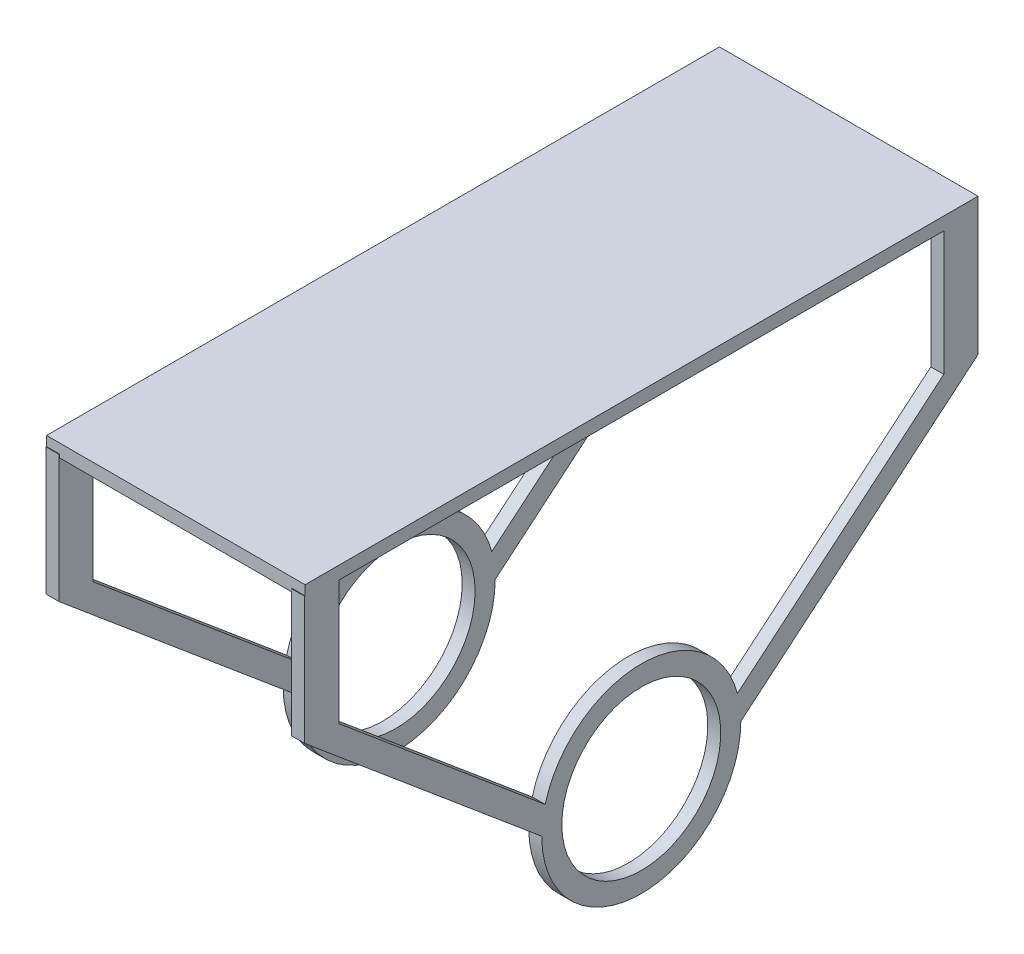
ISO-10303-21;
HEADER;
FILE_DESCRIPTION(('STEP AP214'),'2;1');
FILE_NAME('part.step','',(''),(''),'','','');
FILE_SCHEMA(('AUTOMOTIVE_DESIGN { 1 0 10303 214 1 1 1 1 }'));
ENDSEC;
DATA;
#1=APPLICATION_CONTEXT('core data for automotive mechanical design processes');
#2=APPLICATION_PROTOCOL_DEFINITION('international standard','automotive_design',2000,#1);
#3=PRODUCT_CONTEXT('',#1,'mechanical');
#4=PRODUCT('Part','Part','',(#3));
#5=PRODUCT_RELATED_PRODUCT_CATEGORY('part','',(#4));
#6=PRODUCT_DEFINITION_FORMATION('','',#4);
#7=PRODUCT_DEFINITION_CONTEXT('part definition',#1,'design');
#8=PRODUCT_DEFINITION('design','',#6,#7);
#9=PRODUCT_DEFINITION_SHAPE('','',#8);
#10=(LENGTH_UNIT() NAMED_UNIT(*) SI_UNIT(.MILLI.,.METRE.));
#11=(NAMED_UNIT(*) PLANE_ANGLE_UNIT() SI_UNIT($,.RADIAN.));
#12=(NAMED_UNIT(*) SI_UNIT($,.STERADIAN.) SOLID_ANGLE_UNIT());
#13=UNCERTAINTY_MEASURE_WITH_UNIT(LENGTH_MEASURE(1.E-05),#10,'distance_accuracy_value','');
#14=(GEOMETRIC_REPRESENTATION_CONTEXT(3) GLOBAL_UNCERTAINTY_ASSIGNED_CONTEXT((#13)) GLOBAL_UNIT_ASSIGNED_CONTEXT((#10,
#11,#12)) REPRESENTATION_CONTEXT('',''));
#15=CARTESIAN_POINT('',(0.,0.,0.));
#16=DIRECTION('',(0.,0.,1.));
#17=DIRECTION('',(1.,0.,0.));
#18=AXIS2_PLACEMENT_3D('',#15,#16,#17);
#19=CARTESIAN_POINT('',(10.,0.,0.));
#20=DIRECTION('',(1.,0.,0.));
#21=DIRECTION('',(0.,0.,-1.));
#22=AXIS2_PLACEMENT_3D('',#19,#20,#21);
#23=PLANE('',#22);
#24=CARTESIAN_POINT('',(10.,0.,0.));
#25=DIRECTION('',(1.,0.,0.));
#26=DIRECTION('',(0.,0.,-1.));
#27=AXIS2_PLACEMENT_3D('',#24,#25,#26);
#28=CIRCLE('',#27,61.4685353452793);
#29=CARTESIAN_POINT('',(10.,0.,-61.4685353452793));
#30=VERTEX_POINT('',#29);
#31=EDGE_CURVE('E423',#30,#30,#28,.T.);
#32=ORIENTED_EDGE('',*,*,#31,.F.);
#33=EDGE_LOOP('',(#32));
#34=FACE_BOUND('',#33,.T.);
#35=DIRECTION('',(0.,-1.,0.));
#36=VECTOR('',#35,1.);
#37=CARTESIAN_POINT('',(10.,153.917635940757,-260.43496274968));
#38=LINE('',#37,#36);
#39=CARTESIAN_POINT('',(10.,250.,-260.43496274968));
#40=VERTEX_POINT('',#39);
#41=CARTESIAN_POINT('',(10.,153.917635940757,-260.43496274968));
#42=VERTEX_POINT('',#41);
#43=EDGE_CURVE('E350',#40,#42,#38,.T.);
#44=ORIENTED_EDGE('',*,*,#43,.F.);
#45=DIRECTION('',(0.,0.,1.));
#46=VECTOR('',#45,1.);
#47=CARTESIAN_POINT('',(10.,250.,0.));
#48=LINE('',#47,#46);
#49=CARTESIAN_POINT('',(10.,250.,-233.957245683976));
#50=VERTEX_POINT('',#49);
#51=EDGE_CURVE('E339',#40,#50,#48,.T.);
#52=ORIENTED_EDGE('',*,*,#51,.T.);
#53=DIRECTION('',(0.,1.,0.));
#54=VECTOR('',#53,1.);
#55=CARTESIAN_POINT('',(10.,153.917635940757,-233.957245683976));
#56=LINE('',#55,#54);
#57=CARTESIAN_POINT('',(10.,153.917635940757,-233.957245683976));
#58=VERTEX_POINT('',#57);
#59=EDGE_CURVE('E352',#58,#50,#56,.T.);
#60=ORIENTED_EDGE('',*,*,#59,.F.);
#61=DIRECTION('',(0.,0.642787609686535,-0.766044443118982));
#62=VECTOR('',#61,1.);
#63=CARTESIAN_POINT('',(10.,20.,-74.360421939853));
#64=LINE('',#63,#62);
#65=CARTESIAN_POINT('',(10.,20.,-74.360421939853));
#66=VERTEX_POINT('',#65);
#67=EDGE_CURVE('E363',#66,#58,#64,.T.);
#68=ORIENTED_EDGE('',*,*,#67,.F.);
#69=CARTESIAN_POINT('',(10.,0.,0.));
#70=DIRECTION('',(1.,0.,0.));
#71=DIRECTION('',(0.,0.,-1.));
#72=AXIS2_PLACEMENT_3D('',#69,#70,#71);
#73=CIRCLE('',#72,77.0030671536724);
#74=CARTESIAN_POINT('',(10.,20.,74.360421939853));
#75=VERTEX_POINT('',#74);
#76=EDGE_CURVE('E433',#66,#75,#73,.T.);
#77=ORIENTED_EDGE('',*,*,#76,.T.);
#78=DIRECTION('',(0.,0.642787609686535,0.766044443118982));
#79=VECTOR('',#78,1.);
#80=CARTESIAN_POINT('',(10.,20.,74.360421939853));
#81=LINE('',#80,#79);
#82=CARTESIAN_POINT('',(10.,153.917635940757,233.957245683976));
#83=VERTEX_POINT('',#82);
#84=EDGE_CURVE('E402',#75,#83,#81,.T.);
#85=ORIENTED_EDGE('',*,*,#84,.T.);
#86=DIRECTION('',(0.,1.,0.));
#87=VECTOR('',#86,1.);
#88=CARTESIAN_POINT('',(10.,153.917635940757,233.957245683976));
#89=LINE('',#88,#87);
#90=CARTESIAN_POINT('',(10.,250.,233.957245683976));
#91=VERTEX_POINT('',#90);
#92=EDGE_CURVE('E384',#83,#91,#89,.T.);
#93=ORIENTED_EDGE('',*,*,#92,.T.);
#94=CARTESIAN_POINT('',(10.,250.,260.018805441899));
#95=VERTEX_POINT('',#94);
#96=EDGE_CURVE('E343',#91,#95,#48,.T.);
#97=ORIENTED_EDGE('',*,*,#96,.T.);
#98=DIRECTION('',(0.,1.,0.));
#99=VECTOR('',#98,1.);
#100=CARTESIAN_POINT('',(10.,0.,260.018805441899));
#101=LINE('',#100,#99);
#102=CARTESIAN_POINT('',(10.,252.532858584818,260.018805441899));
#103=VERTEX_POINT('',#102);
#104=EDGE_CURVE('E346',#95,#103,#101,.T.);
#105=ORIENTED_EDGE('',*,*,#104,.T.);
#106=DIRECTION('',(0.,0.,1.));
#107=VECTOR('',#106,1.);
#108=CARTESIAN_POINT('',(10.,252.532858584818,260.43496274968));
#109=LINE('',#108,#107);
#110=CARTESIAN_POINT('',(10.,252.532858584818,260.43496274968));
#111=VERTEX_POINT('',#110);
#112=EDGE_CURVE('E387',#103,#111,#109,.T.);
#113=ORIENTED_EDGE('',*,*,#112,.T.);
#114=DIRECTION('',(0.,-1.,0.));
#115=VECTOR('',#114,1.);
#116=CARTESIAN_POINT('',(10.,153.917635940757,260.43496274968));
#117=LINE('',#116,#115);
#118=CARTESIAN_POINT('',(10.,153.917635940757,260.43496274968));
#119=VERTEX_POINT('',#118);
#120=EDGE_CURVE('E390',#111,#119,#117,.T.);
#121=ORIENTED_EDGE('',*,*,#120,.T.);
#122=DIRECTION('',(0.,-0.642787609686535,-0.766044443118982));
#123=VECTOR('',#122,1.);
#124=CARTESIAN_POINT('',(10.,0.,77.0030671536724));
#125=LINE('',#124,#123);
#126=CARTESIAN_POINT('',(10.,0.,77.0030671536724));
#127=VERTEX_POINT('',#126);
#128=EDGE_CURVE('E404',#119,#127,#125,.T.);
#129=ORIENTED_EDGE('',*,*,#128,.T.);
#130=CARTESIAN_POINT('',(10.,0.,-77.0030671536724));
#131=VERTEX_POINT('',#130);
#132=EDGE_CURVE('E429',#127,#131,#73,.T.);
#133=ORIENTED_EDGE('',*,*,#132,.T.);
#134=DIRECTION('',(0.,-0.642787609686535,0.766044443118982));
#135=VECTOR('',#134,1.);
#136=CARTESIAN_POINT('',(10.,0.,-77.0030671536724));
#137=LINE('',#136,#135);
#138=EDGE_CURVE('E360',#42,#131,#137,.T.);
#139=ORIENTED_EDGE('',*,*,#138,.F.);
#140=EDGE_LOOP('',(#44,#52,#60,#68,#77,#85,#93,#97,#105,#113,#121,#129,#133,#139));
#141=FACE_BOUND('',#140,.T.);
#142=ADVANCED_FACE('F34',(#34,#141),#23,.T.);
#143=CARTESIAN_POINT('',(10.,153.917635940757,233.957245683976));
#144=DIRECTION('',(0.,0.,1.));
#145=DIRECTION('',(1.,0.,0.));
#146=AXIS2_PLACEMENT_3D('',#143,#144,#145);
#147=PLANE('',#146);
#148=DIRECTION('',(-1.,0.,0.));
#149=VECTOR('',#148,1.);
#150=CARTESIAN_POINT('',(10.,250.,233.957245683976));
#151=LINE('',#150,#149);
#152=CARTESIAN_POINT('',(0.,250.,233.957245683976));
#153=VERTEX_POINT('',#152);
#154=EDGE_CURVE('E342',#91,#153,#151,.T.);
#155=ORIENTED_EDGE('',*,*,#154,.F.);
#156=ORIENTED_EDGE('',*,*,#92,.F.);
#157=DIRECTION('',(-1.,0.,0.));
#158=VECTOR('',#157,1.);
#159=CARTESIAN_POINT('',(10.,153.917635940757,233.957245683976));
#160=LINE('',#159,#158);
#161=CARTESIAN_POINT('',(0.,153.917635940757,233.957245683976));
#162=VERTEX_POINT('',#161);
#163=EDGE_CURVE('E416',#83,#162,#160,.T.);
#164=ORIENTED_EDGE('',*,*,#163,.T.);
#165=DIRECTION('',(0.,1.,0.));
#166=VECTOR('',#165,1.);
#167=CARTESIAN_POINT('',(0.,153.917635940757,233.957245683976));
#168=LINE('',#167,#166);
#169=EDGE_CURVE('E383',#162,#153,#168,.T.);
#170=ORIENTED_EDGE('',*,*,#169,.T.);
#171=EDGE_LOOP('',(#155,#156,#164,#170));
#172=FACE_BOUND('',#171,.T.);
#173=ADVANCED_FACE('F512',(#172),#147,.F.);
#174=CARTESIAN_POINT('',(10.,252.532858584818,260.43496274968));
#175=DIRECTION('',(0.,-1.,0.));
#176=DIRECTION('',(0.,0.,-1.));
#177=AXIS2_PLACEMENT_3D('',#174,#175,#176);
#178=PLANE('',#177);
#179=DIRECTION('',(1.,0.,0.));
#180=VECTOR('',#179,1.);
#181=CARTESIAN_POINT('',(10.,252.532858584818,260.018805441899));
#182=LINE('',#181,#180);
#183=CARTESIAN_POINT('',(0.,252.532858584818,260.018805441899));
#184=VERTEX_POINT('',#183);
#185=EDGE_CURVE('E438',#184,#103,#182,.T.);
#186=ORIENTED_EDGE('',*,*,#185,.F.);
#187=DIRECTION('',(0.,0.,1.));
#188=VECTOR('',#187,1.);
#189=CARTESIAN_POINT('',(0.,252.532858584818,260.43496274968));
#190=LINE('',#189,#188);
#191=CARTESIAN_POINT('',(0.,252.532858584818,260.43496274968));
#192=VERTEX_POINT('',#191);
#193=EDGE_CURVE('E395',#184,#192,#190,.T.);
#194=ORIENTED_EDGE('',*,*,#193,.T.);
#195=DIRECTION('',(-1.,0.,0.));
#196=VECTOR('',#195,1.);
#197=CARTESIAN_POINT('',(10.,252.532858584818,260.43496274968));
#198=LINE('',#197,#196);
#199=EDGE_CURVE('E393',#111,#192,#198,.T.);
#200=ORIENTED_EDGE('',*,*,#199,.F.);
#201=ORIENTED_EDGE('',*,*,#112,.F.);
#202=EDGE_LOOP('',(#186,#194,#200,#201));
#203=FACE_BOUND('',#202,.T.);
#204=ADVANCED_FACE('F518',(#203),#178,.F.);
#205=CARTESIAN_POINT('',(10.,153.917635940757,-233.957245683976));
#206=DIRECTION('',(0.,0.,1.));
#207=DIRECTION('',(1.,0.,0.));
#208=AXIS2_PLACEMENT_3D('',#205,#206,#207);
#209=PLANE('',#208);
#210=ORIENTED_EDGE('',*,*,#59,.T.);
#211=DIRECTION('',(-1.,0.,0.));
#212=VECTOR('',#211,1.);
#213=CARTESIAN_POINT('',(10.,250.,-233.957245683976));
#214=LINE('',#213,#212);
#215=CARTESIAN_POINT('',(0.,250.,-233.957245683976));
#216=VERTEX_POINT('',#215);
#217=EDGE_CURVE('E432',#50,#216,#214,.T.);
#218=ORIENTED_EDGE('',*,*,#217,.T.);
#219=DIRECTION('',(0.,1.,0.));
#220=VECTOR('',#219,1.);
#221=CARTESIAN_POINT('',(0.,153.917635940757,-233.957245683976));
#222=LINE('',#221,#220);
#223=CARTESIAN_POINT('',(0.,153.917635940757,-233.957245683976));
#224=VERTEX_POINT('',#223);
#225=EDGE_CURVE('E353',#224,#216,#222,.T.);
#226=ORIENTED_EDGE('',*,*,#225,.F.);
#227=DIRECTION('',(-1.,0.,0.));
#228=VECTOR('',#227,1.);
#229=CARTESIAN_POINT('',(10.,153.917635940757,-233.957245683976));
#230=LINE('',#229,#228);
#231=EDGE_CURVE('E374',#58,#224,#230,.T.);
#232=ORIENTED_EDGE('',*,*,#231,.F.);
#233=EDGE_LOOP('',(#210,#218,#226,#232));
#234=FACE_BOUND('',#233,.T.);
#235=ADVANCED_FACE('F536',(#234),#209,.T.);
#236=CARTESIAN_POINT('',(10.,0.,0.));
#237=DIRECTION('',(-1.,0.,0.));
#238=DIRECTION('',(0.,0.,1.));
#239=AXIS2_PLACEMENT_3D('',#236,#237,#238);
#240=CYLINDRICAL_SURFACE('',#239,77.0030671536724);
#241=CARTESIAN_POINT('',(0.,0.,0.));
#242=DIRECTION('',(1.,0.,0.));
#243=DIRECTION('',(0.,0.,-1.));
#244=AXIS2_PLACEMENT_3D('',#241,#242,#243);
#245=CIRCLE('',#244,77.0030671536724);
#246=CARTESIAN_POINT('',(0.,0.,77.0030671536724));
#247=VERTEX_POINT('',#246);
#248=CARTESIAN_POINT('',(0.,0.,-77.0030671536724));
#249=VERTEX_POINT('',#248);
#250=EDGE_CURVE('E434',#247,#249,#245,.T.);
#251=ORIENTED_EDGE('',*,*,#250,.T.);
#252=DIRECTION('',(-1.,0.,0.));
#253=VECTOR('',#252,1.);
#254=CARTESIAN_POINT('',(10.,0.,-77.0030671536724));
#255=LINE('',#254,#253);
#256=EDGE_CURVE('E380',#131,#249,#255,.T.);
#257=ORIENTED_EDGE('',*,*,#256,.F.);
#258=ORIENTED_EDGE('',*,*,#132,.F.);
#259=DIRECTION('',(-1.,0.,0.));
#260=VECTOR('',#259,1.);
#261=CARTESIAN_POINT('',(10.,0.,77.0030671536724));
#262=LINE('',#261,#260);
#263=EDGE_CURVE('E408',#127,#247,#262,.T.);
#264=ORIENTED_EDGE('',*,*,#263,.T.);
#265=EDGE_LOOP('',(#251,#257,#258,#264));
#266=FACE_BOUND('',#265,.T.);
#267=ADVANCED_FACE('F467',(#266),#240,.T.);
#268=ORIENTED_EDGE('',*,*,#76,.F.);
#269=DIRECTION('',(-1.,0.,0.));
#270=VECTOR('',#269,1.);
#271=CARTESIAN_POINT('',(10.,20.,-74.360421939853));
#272=LINE('',#271,#270);
#273=CARTESIAN_POINT('',(0.,20.,-74.360421939853));
#274=VERTEX_POINT('',#273);
#275=EDGE_CURVE('E367',#66,#274,#272,.T.);
#276=ORIENTED_EDGE('',*,*,#275,.T.);
#277=CARTESIAN_POINT('',(0.,20.,74.360421939853));
#278=VERTEX_POINT('',#277);
#279=EDGE_CURVE('E426',#274,#278,#245,.T.);
#280=ORIENTED_EDGE('',*,*,#279,.T.);
#281=DIRECTION('',(-1.,0.,0.));
#282=VECTOR('',#281,1.);
#283=CARTESIAN_POINT('',(10.,20.,74.360421939853));
#284=LINE('',#283,#282);
#285=EDGE_CURVE('E419',#75,#278,#284,.T.);
#286=ORIENTED_EDGE('',*,*,#285,.F.);
#287=EDGE_LOOP('',(#268,#276,#280,#286));
#288=FACE_BOUND('',#287,.T.);
#289=ADVANCED_FACE('F36',(#288),#240,.T.);
#290=CARTESIAN_POINT('',(0.,0.,0.));
#291=DIRECTION('',(1.,0.,0.));
#292=DIRECTION('',(0.,0.,-1.));
#293=AXIS2_PLACEMENT_3D('',#290,#291,#292);
#294=PLANE('',#293);
#295=ORIENTED_EDGE('',*,*,#193,.F.);
#296=DIRECTION('',(0.,-1.,0.));
#297=VECTOR('',#296,1.);
#298=CARTESIAN_POINT('',(0.,260.,260.018805441899));
#299=LINE('',#298,#297);
#300=CARTESIAN_POINT('',(0.,260.,260.018805441899));
#301=VERTEX_POINT('',#300);
#302=EDGE_CURVE('E336',#301,#184,#299,.T.);
#303=ORIENTED_EDGE('',*,*,#302,.F.);
#304=DIRECTION('',(0.,0.,1.));
#305=VECTOR('',#304,1.);
#306=CARTESIAN_POINT('',(0.,260.,-260.43496274968));
#307=LINE('',#306,#305);
#308=CARTESIAN_POINT('',(0.,260.,-260.43496274968));
#309=VERTEX_POINT('',#308);
#310=EDGE_CURVE('E311',#309,#301,#307,.T.);
#311=ORIENTED_EDGE('',*,*,#310,.F.);
#312=DIRECTION('',(0.,-1.,0.));
#313=VECTOR('',#312,1.);
#314=CARTESIAN_POINT('',(0.,153.917635940757,-260.43496274968));
#315=LINE('',#314,#313);
#316=CARTESIAN_POINT('',(0.,153.917635940757,-260.43496274968));
#317=VERTEX_POINT('',#316);
#318=EDGE_CURVE('E349',#309,#317,#315,.T.);
#319=ORIENTED_EDGE('',*,*,#318,.T.);
#320=DIRECTION('',(0.,-0.642787609686535,0.766044443118982));
#321=VECTOR('',#320,1.);
#322=CARTESIAN_POINT('',(0.,0.,-77.0030671536724));
#323=LINE('',#322,#321);
#324=EDGE_CURVE('E356',#317,#249,#323,.T.);
#325=ORIENTED_EDGE('',*,*,#324,.T.);
#326=ORIENTED_EDGE('',*,*,#250,.F.);
#327=DIRECTION('',(0.,-0.642787609686535,-0.766044443118982));
#328=VECTOR('',#327,1.);
#329=CARTESIAN_POINT('',(0.,0.,77.0030671536724));
#330=LINE('',#329,#328);
#331=CARTESIAN_POINT('',(0.,153.917635940757,260.43496274968));
#332=VERTEX_POINT('',#331);
#333=EDGE_CURVE('E405',#332,#247,#330,.T.);
#334=ORIENTED_EDGE('',*,*,#333,.F.);
#335=DIRECTION('',(0.,-1.,0.));
#336=VECTOR('',#335,1.);
#337=CARTESIAN_POINT('',(0.,153.917635940757,260.43496274968));
#338=LINE('',#337,#336);
#339=EDGE_CURVE('E388',#192,#332,#338,.T.);
#340=ORIENTED_EDGE('',*,*,#339,.F.);
#341=EDGE_LOOP('',(#295,#303,#311,#319,#325,#326,#334,#340));
#342=FACE_BOUND('',#341,.T.);
#343=ORIENTED_EDGE('',*,*,#225,.T.);
#344=DIRECTION('',(0.,0.,1.));
#345=VECTOR('',#344,1.);
#346=CARTESIAN_POINT('',(0.,250.,-260.43496274968));
#347=LINE('',#346,#345);
#348=EDGE_CURVE('E310',#216,#153,#347,.T.);
#349=ORIENTED_EDGE('',*,*,#348,.T.);
#350=ORIENTED_EDGE('',*,*,#169,.F.);
#351=DIRECTION('',(0.,0.642787609686535,0.766044443118982));
#352=VECTOR('',#351,1.);
#353=CARTESIAN_POINT('',(0.,20.,74.360421939853));
#354=LINE('',#353,#352);
#355=EDGE_CURVE('E401',#278,#162,#354,.T.);
#356=ORIENTED_EDGE('',*,*,#355,.F.);
#357=ORIENTED_EDGE('',*,*,#279,.F.);
#358=DIRECTION('',(0.,0.642787609686535,-0.766044443118982));
#359=VECTOR('',#358,1.);
#360=CARTESIAN_POINT('',(0.,20.,-74.360421939853));
#361=LINE('',#360,#359);
#362=EDGE_CURVE('E364',#274,#224,#361,.T.);
#363=ORIENTED_EDGE('',*,*,#362,.T.);
#364=EDGE_LOOP('',(#343,#349,#350,#356,#357,#363));
#365=FACE_BOUND('',#364,.T.);
#366=CARTESIAN_POINT('',(0.,0.,0.));
#367=DIRECTION('',(1.,0.,0.));
#368=DIRECTION('',(0.,0.,-1.));
#369=AXIS2_PLACEMENT_3D('',#366,#367,#368);
#370=CIRCLE('',#369,61.4685353452793);
#371=CARTESIAN_POINT('',(0.,0.,-61.4685353452793));
#372=VERTEX_POINT('',#371);
#373=EDGE_CURVE('E422',#372,#372,#370,.T.);
#374=ORIENTED_EDGE('',*,*,#373,.T.);
#375=EDGE_LOOP('',(#374));
#376=FACE_BOUND('',#375,.T.);
#377=ADVANCED_FACE('F470',(#342,#365,#376),#294,.F.);
#378=CARTESIAN_POINT('',(10.,0.,0.));
#379=DIRECTION('',(-1.,0.,0.));
#380=DIRECTION('',(0.,0.,1.));
#381=AXIS2_PLACEMENT_3D('',#378,#379,#380);
#382=CYLINDRICAL_SURFACE('',#381,61.4685353452793);
#383=ORIENTED_EDGE('',*,*,#31,.T.);
#384=EDGE_LOOP('',(#383));
#385=FACE_BOUND('',#384,.T.);
#386=ORIENTED_EDGE('',*,*,#373,.F.);
#387=EDGE_LOOP('',(#386));
#388=FACE_BOUND('',#387,.T.);
#389=ADVANCED_FACE('F523',(#385,#388),#382,.F.);
#390=CARTESIAN_POINT('',(10.,20.,74.360421939853));
#391=DIRECTION('',(0.,-0.766044443118982,0.642787609686535));
#392=DIRECTION('',(0.,-0.642787609686535,-0.766044443118982));
#393=AXIS2_PLACEMENT_3D('',#390,#391,#392);
#394=PLANE('',#393);
#395=ORIENTED_EDGE('',*,*,#355,.T.);
#396=ORIENTED_EDGE('',*,*,#163,.F.);
#397=ORIENTED_EDGE('',*,*,#84,.F.);
#398=ORIENTED_EDGE('',*,*,#285,.T.);
#399=EDGE_LOOP('',(#395,#396,#397,#398));
#400=FACE_BOUND('',#399,.T.);
#401=ADVANCED_FACE('F530',(#400),#394,.F.);
#402=CARTESIAN_POINT('',(10.,0.,77.0030671536724));
#403=DIRECTION('',(0.,0.766044443118982,-0.642787609686535));
#404=DIRECTION('',(0.,0.642787609686535,0.766044443118982));
#405=AXIS2_PLACEMENT_3D('',#402,#403,#404);
#406=PLANE('',#405);
#407=ORIENTED_EDGE('',*,*,#333,.T.);
#408=ORIENTED_EDGE('',*,*,#263,.F.);
#409=ORIENTED_EDGE('',*,*,#128,.F.);
#410=DIRECTION('',(-1.,0.,0.));
#411=VECTOR('',#410,1.);
#412=CARTESIAN_POINT('',(10.,153.917635940757,260.43496274968));
#413=LINE('',#412,#411);
#414=EDGE_CURVE('E414',#119,#332,#413,.T.);
#415=ORIENTED_EDGE('',*,*,#414,.T.);
#416=EDGE_LOOP('',(#407,#408,#409,#415));
#417=FACE_BOUND('',#416,.T.);
#418=ADVANCED_FACE('F564',(#417),#406,.F.);
#419=CARTESIAN_POINT('',(10.,153.917635940757,260.43496274968));
#420=DIRECTION('',(0.,0.,-1.));
#421=DIRECTION('',(-1.,0.,0.));
#422=AXIS2_PLACEMENT_3D('',#419,#420,#421);
#423=PLANE('',#422);
#424=ORIENTED_EDGE('',*,*,#339,.T.);
#425=ORIENTED_EDGE('',*,*,#414,.F.);
#426=ORIENTED_EDGE('',*,*,#120,.F.);
#427=ORIENTED_EDGE('',*,*,#199,.T.);
#428=EDGE_LOOP('',(#424,#425,#426,#427));
#429=FACE_BOUND('',#428,.T.);
#430=ADVANCED_FACE('F562',(#429),#423,.F.);
#431=CARTESIAN_POINT('',(10.,0.,-77.0030671536724));
#432=DIRECTION('',(0.,-0.766044443118982,-0.642787609686535));
#433=DIRECTION('',(0.,0.642787609686535,-0.766044443118982));
#434=AXIS2_PLACEMENT_3D('',#431,#432,#433);
#435=PLANE('',#434);
#436=ORIENTED_EDGE('',*,*,#324,.F.);
#437=DIRECTION('',(-1.,0.,0.));
#438=VECTOR('',#437,1.);
#439=CARTESIAN_POINT('',(10.,153.917635940757,-260.43496274968));
#440=LINE('',#439,#438);
#441=EDGE_CURVE('E377',#42,#317,#440,.T.);
#442=ORIENTED_EDGE('',*,*,#441,.F.);
#443=ORIENTED_EDGE('',*,*,#138,.T.);
#444=ORIENTED_EDGE('',*,*,#256,.T.);
#445=EDGE_LOOP('',(#436,#442,#443,#444));
#446=FACE_BOUND('',#445,.T.);
#447=ADVANCED_FACE('F464',(#446),#435,.T.);
#448=CARTESIAN_POINT('',(10.,20.,-74.360421939853));
#449=DIRECTION('',(0.,0.766044443118982,0.642787609686535));
#450=DIRECTION('',(0.,-0.642787609686535,0.766044443118982));
#451=AXIS2_PLACEMENT_3D('',#448,#449,#450);
#452=PLANE('',#451);
#453=ORIENTED_EDGE('',*,*,#362,.F.);
#454=ORIENTED_EDGE('',*,*,#275,.F.);
#455=ORIENTED_EDGE('',*,*,#67,.T.);
#456=ORIENTED_EDGE('',*,*,#231,.T.);
#457=EDGE_LOOP('',(#453,#454,#455,#456));
#458=FACE_BOUND('',#457,.T.);
#459=ADVANCED_FACE('F543',(#458),#452,.T.);
#460=CARTESIAN_POINT('',(10.,153.917635940757,-260.43496274968));
#461=DIRECTION('',(0.,0.,-1.));
#462=DIRECTION('',(-1.,0.,0.));
#463=AXIS2_PLACEMENT_3D('',#460,#461,#462);
#464=PLANE('',#463);
#465=DIRECTION('',(0.,-1.,0.));
#466=VECTOR('',#465,1.);
#467=CARTESIAN_POINT('',(190.000000000002,153.917635940757,-260.434962749678));
#468=LINE('',#467,#466);
#469=CARTESIAN_POINT('',(190.000000000002,250.,-260.43496274968));
#470=VERTEX_POINT('',#469);
#471=CARTESIAN_POINT('',(190.000000000002,153.917635940757,-260.434962749678));
#472=VERTEX_POINT('',#471);
#473=EDGE_CURVE('E58',#470,#472,#468,.T.);
#474=ORIENTED_EDGE('',*,*,#473,.F.);
#475=DIRECTION('',(-1.,0.,0.));
#476=VECTOR('',#475,1.);
#477=CARTESIAN_POINT('',(0.,250.,-260.43496274968));
#478=LINE('',#477,#476);
#479=EDGE_CURVE('E315',#470,#40,#478,.T.);
#480=ORIENTED_EDGE('',*,*,#479,.T.);
#481=ORIENTED_EDGE('',*,*,#43,.T.);
#482=ORIENTED_EDGE('',*,*,#441,.T.);
#483=ORIENTED_EDGE('',*,*,#318,.F.);
#484=DIRECTION('',(-1.,0.,0.));
#485=VECTOR('',#484,1.);
#486=CARTESIAN_POINT('',(0.,260.,-260.43496274968));
#487=LINE('',#486,#485);
#488=CARTESIAN_POINT('',(199.999999999998,260.,-260.43496274968));
#489=VERTEX_POINT('',#488);
#490=EDGE_CURVE('E319',#489,#309,#487,.T.);
#491=ORIENTED_EDGE('',*,*,#490,.F.);
#492=DIRECTION('',(0.,-1.,0.));
#493=VECTOR('',#492,1.);
#494=CARTESIAN_POINT('',(199.999999999998,260.,-260.43496274968));
#495=LINE('',#494,#493);
#496=CARTESIAN_POINT('',(200.000000000002,153.917635940757,-260.434962749678));
#497=VERTEX_POINT('',#496);
#498=EDGE_CURVE('E322',#489,#497,#495,.T.);
#499=ORIENTED_EDGE('',*,*,#498,.T.);
#500=DIRECTION('',(1.,0.,0.));
#501=VECTOR('',#500,1.);
#502=CARTESIAN_POINT('',(190.000000000002,153.917635940757,-260.434962749678));
#503=LINE('',#502,#501);
#504=EDGE_CURVE('E284',#472,#497,#503,.T.);
#505=ORIENTED_EDGE('',*,*,#504,.F.);
#506=EDGE_LOOP('',(#474,#480,#481,#482,#483,#491,#499,#505));
#507=FACE_BOUND('',#506,.T.);
#508=ADVANCED_FACE('F458',(#507),#464,.T.);
#509=CARTESIAN_POINT('',(0.,260.,260.018805441899));
#510=DIRECTION('',(0.,0.,-1.));
#511=DIRECTION('',(-1.,0.,0.));
#512=AXIS2_PLACEMENT_3D('',#509,#510,#511);
#513=PLANE('',#512);
#514=DIRECTION('',(1.,0.,0.));
#515=VECTOR('',#514,1.);
#516=CARTESIAN_POINT('',(0.,250.,260.018805441899));
#517=LINE('',#516,#515);
#518=CARTESIAN_POINT('',(189.999999999998,250.,260.018805441899));
#519=VERTEX_POINT('',#518);
#520=EDGE_CURVE('E325',#95,#519,#517,.T.);
#521=ORIENTED_EDGE('',*,*,#520,.T.);
#522=DIRECTION('',(0.,1.,0.));
#523=VECTOR('',#522,1.);
#524=CARTESIAN_POINT('',(189.999999999998,260.,260.018805441899));
#525=LINE('',#524,#523);
#526=CARTESIAN_POINT('',(190.000000000002,252.532858584818,260.018805441899));
#527=VERTEX_POINT('',#526);
#528=EDGE_CURVE('E301',#519,#527,#525,.T.);
#529=ORIENTED_EDGE('',*,*,#528,.T.);
#530=DIRECTION('',(1.,0.,0.));
#531=VECTOR('',#530,1.);
#532=CARTESIAN_POINT('',(0.,252.532858584818,260.018805441899));
#533=LINE('',#532,#531);
#534=CARTESIAN_POINT('',(200.000000000002,252.532858584818,260.018805441899));
#535=VERTEX_POINT('',#534);
#536=EDGE_CURVE('E307',#527,#535,#533,.T.);
#537=ORIENTED_EDGE('',*,*,#536,.T.);
#538=DIRECTION('',(0.,-1.,0.));
#539=VECTOR('',#538,1.);
#540=CARTESIAN_POINT('',(199.999999999998,260.,260.018805441899));
#541=LINE('',#540,#539);
#542=CARTESIAN_POINT('',(199.999999999998,260.,260.018805441899));
#543=VERTEX_POINT('',#542);
#544=EDGE_CURVE('E333',#543,#535,#541,.T.);
#545=ORIENTED_EDGE('',*,*,#544,.F.);
#546=DIRECTION('',(1.,0.,0.));
#547=VECTOR('',#546,1.);
#548=CARTESIAN_POINT('',(0.,260.,260.018805441899));
#549=LINE('',#548,#547);
#550=EDGE_CURVE('E314',#301,#543,#549,.T.);
#551=ORIENTED_EDGE('',*,*,#550,.F.);
#552=ORIENTED_EDGE('',*,*,#302,.T.);
#553=ORIENTED_EDGE('',*,*,#185,.T.);
#554=ORIENTED_EDGE('',*,*,#104,.F.);
#555=EDGE_LOOP('',(#521,#529,#537,#545,#551,#552,#553,#554));
#556=FACE_BOUND('',#555,.T.);
#557=ADVANCED_FACE('F555',(#556),#513,.F.);
#558=CARTESIAN_POINT('',(199.999999999998,260.,-260.43496274968));
#559=DIRECTION('',(-1.,0.,0.));
#560=DIRECTION('',(0.,0.,1.));
#561=AXIS2_PLACEMENT_3D('',#558,#559,#560);
#562=PLANE('',#561);
#563=ORIENTED_EDGE('',*,*,#544,.T.);
#564=DIRECTION('',(0.,0.,1.));
#565=VECTOR('',#564,1.);
#566=CARTESIAN_POINT('',(200.000000000002,252.532858584818,233.957245683975));
#567=LINE('',#566,#565);
#568=CARTESIAN_POINT('',(200.000000000002,252.532858584818,260.434962749678));
#569=VERTEX_POINT('',#568);
#570=EDGE_CURVE('E492',#535,#569,#567,.T.);
#571=ORIENTED_EDGE('',*,*,#570,.T.);
#572=DIRECTION('',(0.,-1.,0.));
#573=VECTOR('',#572,1.);
#574=CARTESIAN_POINT('',(200.000000000002,153.917635940757,260.434962749678));
#575=LINE('',#574,#573);
#576=CARTESIAN_POINT('',(200.000000000002,153.917635940757,260.434962749678));
#577=VERTEX_POINT('',#576);
#578=EDGE_CURVE('E491',#569,#577,#575,.T.);
#579=ORIENTED_EDGE('',*,*,#578,.T.);
#580=DIRECTION('',(0.,-0.642787609686535,-0.766044443118982));
#581=VECTOR('',#580,1.);
#582=CARTESIAN_POINT('',(200.000000000001,0.,77.003067153671));
#583=LINE('',#582,#581);
#584=CARTESIAN_POINT('',(199.999999999999,0.,77.0030671536724));
#585=VERTEX_POINT('',#584);
#586=EDGE_CURVE('E241',#577,#585,#583,.T.);
#587=ORIENTED_EDGE('',*,*,#586,.T.);
#588=CARTESIAN_POINT('',(200.,0.,0.));
#589=DIRECTION('',(-1.,0.,0.));
#590=DIRECTION('',(0.,0.,1.));
#591=AXIS2_PLACEMENT_3D('',#588,#589,#590);
#592=CIRCLE('',#591,77.0030671536724);
#593=CARTESIAN_POINT('',(200.000000000001,0.,-77.003067153671));
#594=VERTEX_POINT('',#593);
#595=EDGE_CURVE('E303',#594,#585,#592,.T.);
#596=ORIENTED_EDGE('',*,*,#595,.F.);
#597=DIRECTION('',(0.,-0.642787609686535,0.766044443118982));
#598=VECTOR('',#597,1.);
#599=CARTESIAN_POINT('',(200.000000000001,0.,-77.003067153671));
#600=LINE('',#599,#598);
#601=EDGE_CURVE('E276',#497,#594,#600,.T.);
#602=ORIENTED_EDGE('',*,*,#601,.F.);
#603=ORIENTED_EDGE('',*,*,#498,.F.);
#604=DIRECTION('',(0.,0.,-1.));
#605=VECTOR('',#604,1.);
#606=CARTESIAN_POINT('',(199.999999999998,260.,-260.43496274968));
#607=LINE('',#606,#605);
#608=EDGE_CURVE('E317',#543,#489,#607,.T.);
#609=ORIENTED_EDGE('',*,*,#608,.F.);
#610=EDGE_LOOP('',(#563,#571,#579,#587,#596,#602,#603,#609));
#611=FACE_BOUND('',#610,.T.);
#612=DIRECTION('',(0.,0.,-1.));
#613=VECTOR('',#612,1.);
#614=CARTESIAN_POINT('',(199.999999999998,250.,-260.43496274968));
#615=LINE('',#614,#613);
#616=CARTESIAN_POINT('',(200.000000000002,250.,233.957245683975));
#617=VERTEX_POINT('',#616);
#618=CARTESIAN_POINT('',(200.000000000002,250.,-233.957245683975));
#619=VERTEX_POINT('',#618);
#620=EDGE_CURVE('E328',#617,#619,#615,.T.);
#621=ORIENTED_EDGE('',*,*,#620,.T.);
#622=DIRECTION('',(0.,1.,0.));
#623=VECTOR('',#622,1.);
#624=CARTESIAN_POINT('',(200.000000000002,153.917635940757,-233.957245683975));
#625=LINE('',#624,#623);
#626=CARTESIAN_POINT('',(200.000000000002,153.917635940757,-233.957245683975));
#627=VERTEX_POINT('',#626);
#628=EDGE_CURVE('E266',#627,#619,#625,.T.);
#629=ORIENTED_EDGE('',*,*,#628,.F.);
#630=DIRECTION('',(0.,0.642787609686535,-0.766044443118982));
#631=VECTOR('',#630,1.);
#632=CARTESIAN_POINT('',(200.000000000001,20.,-74.3604219398516));
#633=LINE('',#632,#631);
#634=CARTESIAN_POINT('',(200.000000000001,20.0000000000003,-74.3604219398529));
#635=VERTEX_POINT('',#634);
#636=EDGE_CURVE('E271',#635,#627,#633,.T.);
#637=ORIENTED_EDGE('',*,*,#636,.F.);
#638=CARTESIAN_POINT('',(200.000000000001,20.,74.3604219398516));
#639=VERTEX_POINT('',#638);
#640=EDGE_CURVE('E297',#639,#635,#592,.T.);
#641=ORIENTED_EDGE('',*,*,#640,.F.);
#642=DIRECTION('',(0.,0.642787609686535,0.766044443118982));
#643=VECTOR('',#642,1.);
#644=CARTESIAN_POINT('',(200.000000000001,20.,74.3604219398516));
#645=LINE('',#644,#643);
#646=CARTESIAN_POINT('',(200.000000000002,153.917635940757,233.957245683975));
#647=VERTEX_POINT('',#646);
#648=EDGE_CURVE('E250',#639,#647,#645,.T.);
#649=ORIENTED_EDGE('',*,*,#648,.T.);
#650=DIRECTION('',(0.,1.,0.));
#651=VECTOR('',#650,1.);
#652=CARTESIAN_POINT('',(200.000000000002,153.917635940757,233.957245683975));
#653=LINE('',#652,#651);
#654=EDGE_CURVE('E232',#647,#617,#653,.T.);
#655=ORIENTED_EDGE('',*,*,#654,.T.);
#656=EDGE_LOOP('',(#621,#629,#637,#641,#649,#655));
#657=FACE_BOUND('',#656,.T.);
#658=CARTESIAN_POINT('',(200.,0.,0.));
#659=DIRECTION('',(-1.,0.,0.));
#660=DIRECTION('',(0.,0.,1.));
#661=AXIS2_PLACEMENT_3D('',#658,#659,#660);
#662=CIRCLE('',#661,61.4685353452793);
#663=CARTESIAN_POINT('',(200.,0.,61.4685353452793));
#664=VERTEX_POINT('',#663);
#665=EDGE_CURVE('E293',#664,#664,#662,.T.);
#666=ORIENTED_EDGE('',*,*,#665,.T.);
#667=EDGE_LOOP('',(#666));
#668=FACE_BOUND('',#667,.T.);
#669=ADVANCED_FACE('F483',(#611,#657,#668),#562,.F.);
#670=CARTESIAN_POINT('',(0.,260.,0.));
#671=DIRECTION('',(0.,1.,0.));
#672=DIRECTION('',(0.,0.,1.));
#673=AXIS2_PLACEMENT_3D('',#670,#671,#672);
#674=PLANE('',#673);
#675=ORIENTED_EDGE('',*,*,#310,.T.);
#676=ORIENTED_EDGE('',*,*,#550,.T.);
#677=ORIENTED_EDGE('',*,*,#608,.T.);
#678=ORIENTED_EDGE('',*,*,#490,.T.);
#679=EDGE_LOOP('',(#675,#676,#677,#678));
#680=FACE_BOUND('',#679,.T.);
#681=ADVANCED_FACE('F477',(#680),#674,.T.);
#682=CARTESIAN_POINT('',(0.,250.,0.));
#683=DIRECTION('',(0.,1.,0.));
#684=DIRECTION('',(0.,0.,1.));
#685=AXIS2_PLACEMENT_3D('',#682,#683,#684);
#686=PLANE('',#685);
#687=ORIENTED_EDGE('',*,*,#479,.F.);
#688=DIRECTION('',(0.,0.,1.));
#689=VECTOR('',#688,1.);
#690=CARTESIAN_POINT('',(190.,250.,1.32676290876039E-12));
#691=LINE('',#690,#689);
#692=CARTESIAN_POINT('',(190.000000000002,250.,-233.957245683975));
#693=VERTEX_POINT('',#692);
#694=EDGE_CURVE('E11',#470,#693,#691,.T.);
#695=ORIENTED_EDGE('',*,*,#694,.T.);
#696=DIRECTION('',(-1.,0.,0.));
#697=VECTOR('',#696,1.);
#698=CARTESIAN_POINT('',(1.63371471478548E-12,250.,-233.957245683976));
#699=LINE('',#698,#697);
#700=EDGE_CURVE('E38',#619,#693,#699,.T.);
#701=ORIENTED_EDGE('',*,*,#700,.F.);
#702=ORIENTED_EDGE('',*,*,#620,.F.);
#703=DIRECTION('',(-1.,0.,0.));
#704=VECTOR('',#703,1.);
#705=CARTESIAN_POINT('',(1.63371471478548E-12,250.,233.957245683976));
#706=LINE('',#705,#704);
#707=CARTESIAN_POINT('',(190.000000000002,250.,233.957245683975));
#708=VERTEX_POINT('',#707);
#709=EDGE_CURVE('E441',#617,#708,#706,.T.);
#710=ORIENTED_EDGE('',*,*,#709,.T.);
#711=EDGE_CURVE('E43',#708,#519,#691,.T.);
#712=ORIENTED_EDGE('',*,*,#711,.T.);
#713=ORIENTED_EDGE('',*,*,#520,.F.);
#714=ORIENTED_EDGE('',*,*,#96,.F.);
#715=ORIENTED_EDGE('',*,*,#154,.T.);
#716=ORIENTED_EDGE('',*,*,#348,.F.);
#717=ORIENTED_EDGE('',*,*,#217,.F.);
#718=ORIENTED_EDGE('',*,*,#51,.F.);
#719=EDGE_LOOP('',(#687,#695,#701,#702,#710,#712,#713,#714,#715,#716,#717,#718));
#720=FACE_BOUND('',#719,.T.);
#721=ADVANCED_FACE('F455',(#720),#686,.F.);
#722=CARTESIAN_POINT('',(190.000000000002,252.532858584818,233.957245683975));
#723=DIRECTION('',(0.,1.,0.));
#724=DIRECTION('',(0.,0.,1.));
#725=AXIS2_PLACEMENT_3D('',#722,#723,#724);
#726=PLANE('',#725);
#727=ORIENTED_EDGE('',*,*,#536,.F.);
#728=DIRECTION('',(0.,0.,1.));
#729=VECTOR('',#728,1.);
#730=CARTESIAN_POINT('',(190.000000000002,252.532858584818,233.957245683975));
#731=LINE('',#730,#729);
#732=CARTESIAN_POINT('',(190.000000000002,252.532858584818,260.434962749679));
#733=VERTEX_POINT('',#732);
#734=EDGE_CURVE('E231',#527,#733,#731,.T.);
#735=ORIENTED_EDGE('',*,*,#734,.T.);
#736=DIRECTION('',(1.,0.,0.));
#737=VECTOR('',#736,1.);
#738=CARTESIAN_POINT('',(190.000000000002,252.532858584818,260.434962749679));
#739=LINE('',#738,#737);
#740=EDGE_CURVE('E227',#733,#569,#739,.T.);
#741=ORIENTED_EDGE('',*,*,#740,.T.);
#742=ORIENTED_EDGE('',*,*,#570,.F.);
#743=EDGE_LOOP('',(#727,#735,#741,#742));
#744=FACE_BOUND('',#743,.T.);
#745=ADVANCED_FACE('F566',(#744),#726,.T.);
#746=CARTESIAN_POINT('',(190.,0.,0.));
#747=DIRECTION('',(-1.,0.,0.));
#748=DIRECTION('',(0.,0.,1.));
#749=AXIS2_PLACEMENT_3D('',#746,#747,#748);
#750=PLANE('',#749);
#751=CARTESIAN_POINT('',(190.,0.,0.));
#752=DIRECTION('',(-1.,0.,0.));
#753=DIRECTION('',(0.,0.,1.));
#754=AXIS2_PLACEMENT_3D('',#751,#752,#753);
#755=CIRCLE('',#754,61.4685353452793);
#756=CARTESIAN_POINT('',(190.,0.,61.4685353452793));
#757=VERTEX_POINT('',#756);
#758=EDGE_CURVE('E294',#757,#757,#755,.T.);
#759=ORIENTED_EDGE('',*,*,#758,.F.);
#760=EDGE_LOOP('',(#759));
#761=FACE_BOUND('',#760,.T.);
#762=ORIENTED_EDGE('',*,*,#694,.F.);
#763=ORIENTED_EDGE('',*,*,#473,.T.);
#764=DIRECTION('',(0.,-0.642787609686535,0.766044443118982));
#765=VECTOR('',#764,1.);
#766=CARTESIAN_POINT('',(190.000000000001,0.,-77.003067153671));
#767=LINE('',#766,#765);
#768=CARTESIAN_POINT('',(190.000000000001,0.,-77.0030671536724));
#769=VERTEX_POINT('',#768);
#770=EDGE_CURVE('E275',#472,#769,#767,.T.);
#771=ORIENTED_EDGE('',*,*,#770,.T.);
#772=CARTESIAN_POINT('',(190.,0.,0.));
#773=DIRECTION('',(-1.,0.,0.));
#774=DIRECTION('',(0.,0.,1.));
#775=AXIS2_PLACEMENT_3D('',#772,#773,#774);
#776=CIRCLE('',#775,77.0030671536724);
#777=CARTESIAN_POINT('',(189.999999999999,0.,77.0030671536723));
#778=VERTEX_POINT('',#777);
#779=EDGE_CURVE('E248',#769,#778,#776,.T.);
#780=ORIENTED_EDGE('',*,*,#779,.T.);
#781=DIRECTION('',(0.,-0.642787609686535,-0.766044443118982));
#782=VECTOR('',#781,1.);
#783=CARTESIAN_POINT('',(190.000000000001,0.,77.003067153671));
#784=LINE('',#783,#782);
#785=CARTESIAN_POINT('',(190.000000000002,153.917635940757,260.434962749678));
#786=VERTEX_POINT('',#785);
#787=EDGE_CURVE('E239',#786,#778,#784,.T.);
#788=ORIENTED_EDGE('',*,*,#787,.F.);
#789=DIRECTION('',(0.,-1.,0.));
#790=VECTOR('',#789,1.);
#791=CARTESIAN_POINT('',(190.000000000002,153.917635940757,260.434962749678));
#792=LINE('',#791,#790);
#793=EDGE_CURVE('E220',#733,#786,#792,.T.);
#794=ORIENTED_EDGE('',*,*,#793,.F.);
#795=ORIENTED_EDGE('',*,*,#734,.F.);
#796=ORIENTED_EDGE('',*,*,#528,.F.);
#797=ORIENTED_EDGE('',*,*,#711,.F.);
#798=DIRECTION('',(0.,1.,0.));
#799=VECTOR('',#798,1.);
#800=CARTESIAN_POINT('',(190.000000000002,153.917635940757,233.957245683975));
#801=LINE('',#800,#799);
#802=CARTESIAN_POINT('',(190.000000000002,153.917635940757,233.957245683975));
#803=VERTEX_POINT('',#802);
#804=EDGE_CURVE('E50',#803,#708,#801,.T.);
#805=ORIENTED_EDGE('',*,*,#804,.F.);
#806=DIRECTION('',(0.,0.642787609686535,0.766044443118982));
#807=VECTOR('',#806,1.);
#808=CARTESIAN_POINT('',(190.000000000001,20.,74.3604219398517));
#809=LINE('',#808,#807);
#810=CARTESIAN_POINT('',(189.999999999999,20.0000000000009,74.3604219398527));
#811=VERTEX_POINT('',#810);
#812=EDGE_CURVE('E249',#811,#803,#809,.T.);
#813=ORIENTED_EDGE('',*,*,#812,.F.);
#814=CARTESIAN_POINT('',(190.000000000001,20.0000000000003,-74.360421939853));
#815=VERTEX_POINT('',#814);
#816=EDGE_CURVE('E302',#811,#815,#776,.T.);
#817=ORIENTED_EDGE('',*,*,#816,.T.);
#818=DIRECTION('',(0.,0.642787609686535,-0.766044443118982));
#819=VECTOR('',#818,1.);
#820=CARTESIAN_POINT('',(190.000000000001,20.,-74.3604219398517));
#821=LINE('',#820,#819);
#822=CARTESIAN_POINT('',(190.000000000002,153.917635940757,-233.957245683975));
#823=VERTEX_POINT('',#822);
#824=EDGE_CURVE('E273',#815,#823,#821,.T.);
#825=ORIENTED_EDGE('',*,*,#824,.T.);
#826=DIRECTION('',(0.,1.,0.));
#827=VECTOR('',#826,1.);
#828=CARTESIAN_POINT('',(190.000000000002,153.917635940757,-233.957245683975));
#829=LINE('',#828,#827);
#830=EDGE_CURVE('E267',#823,#693,#829,.T.);
#831=ORIENTED_EDGE('',*,*,#830,.T.);
#832=EDGE_LOOP('',(#762,#763,#771,#780,#788,#794,#795,#796,#797,#805,#813,#817,#825,#831));
#833=FACE_BOUND('',#832,.T.);
#834=ADVANCED_FACE('F246',(#761,#833),#750,.T.);
#835=CARTESIAN_POINT('',(190.000000000002,153.917635940757,-233.957245683975));
#836=DIRECTION('',(0.,0.,-1.));
#837=DIRECTION('',(-1.,0.,0.));
#838=AXIS2_PLACEMENT_3D('',#835,#836,#837);
#839=PLANE('',#838);
#840=ORIENTED_EDGE('',*,*,#628,.T.);
#841=ORIENTED_EDGE('',*,*,#700,.T.);
#842=ORIENTED_EDGE('',*,*,#830,.F.);
#843=DIRECTION('',(1.,0.,0.));
#844=VECTOR('',#843,1.);
#845=CARTESIAN_POINT('',(190.000000000002,153.917635940757,-233.957245683975));
#846=LINE('',#845,#844);
#847=EDGE_CURVE('E287',#823,#627,#846,.T.);
#848=ORIENTED_EDGE('',*,*,#847,.T.);
#849=EDGE_LOOP('',(#840,#841,#842,#848));
#850=FACE_BOUND('',#849,.T.);
#851=ADVANCED_FACE('F449',(#850),#839,.F.);
#852=CARTESIAN_POINT('',(190.000000000002,153.917635940757,233.957245683975));
#853=DIRECTION('',(0.,0.,-1.));
#854=DIRECTION('',(-1.,0.,0.));
#855=AXIS2_PLACEMENT_3D('',#852,#853,#854);
#856=PLANE('',#855);
#857=ORIENTED_EDGE('',*,*,#709,.F.);
#858=ORIENTED_EDGE('',*,*,#654,.F.);
#859=DIRECTION('',(1.,0.,0.));
#860=VECTOR('',#859,1.);
#861=CARTESIAN_POINT('',(190.000000000002,153.917635940757,233.957245683975));
#862=LINE('',#861,#860);
#863=EDGE_CURVE('E243',#803,#647,#862,.T.);
#864=ORIENTED_EDGE('',*,*,#863,.F.);
#865=ORIENTED_EDGE('',*,*,#804,.T.);
#866=EDGE_LOOP('',(#857,#858,#864,#865));
#867=FACE_BOUND('',#866,.T.);
#868=ADVANCED_FACE('F500',(#867),#856,.T.);
#869=CARTESIAN_POINT('',(190.,0.,0.));
#870=DIRECTION('',(1.,0.,0.));
#871=DIRECTION('',(0.,0.,-1.));
#872=AXIS2_PLACEMENT_3D('',#869,#870,#871);
#873=CYLINDRICAL_SURFACE('',#872,77.0030671536724);
#874=ORIENTED_EDGE('',*,*,#595,.T.);
#875=DIRECTION('',(1.,0.,0.));
#876=VECTOR('',#875,1.);
#877=CARTESIAN_POINT('',(190.000000000001,0.,77.003067153671));
#878=LINE('',#877,#876);
#879=EDGE_CURVE('E242',#778,#585,#878,.T.);
#880=ORIENTED_EDGE('',*,*,#879,.F.);
#881=ORIENTED_EDGE('',*,*,#779,.F.);
#882=DIRECTION('',(1.,0.,0.));
#883=VECTOR('',#882,1.);
#884=CARTESIAN_POINT('',(190.000000000001,0.,-77.003067153671));
#885=LINE('',#884,#883);
#886=EDGE_CURVE('E278',#769,#594,#885,.T.);
#887=ORIENTED_EDGE('',*,*,#886,.T.);
#888=EDGE_LOOP('',(#874,#880,#881,#887));
#889=FACE_BOUND('',#888,.T.);
#890=ADVANCED_FACE('F490',(#889),#873,.T.);
#891=ORIENTED_EDGE('',*,*,#816,.F.);
#892=DIRECTION('',(1.,0.,0.));
#893=VECTOR('',#892,1.);
#894=CARTESIAN_POINT('',(190.000000000001,20.,74.3604219398517));
#895=LINE('',#894,#893);
#896=EDGE_CURVE('E253',#811,#639,#895,.T.);
#897=ORIENTED_EDGE('',*,*,#896,.T.);
#898=ORIENTED_EDGE('',*,*,#640,.T.);
#899=DIRECTION('',(1.,0.,0.));
#900=VECTOR('',#899,1.);
#901=CARTESIAN_POINT('',(190.000000000001,20.,-74.3604219398517));
#902=LINE('',#901,#900);
#903=EDGE_CURVE('E290',#815,#635,#902,.T.);
#904=ORIENTED_EDGE('',*,*,#903,.F.);
#905=EDGE_LOOP('',(#891,#897,#898,#904));
#906=FACE_BOUND('',#905,.T.);
#907=ADVANCED_FACE('F507',(#906),#873,.T.);
#908=CARTESIAN_POINT('',(190.,0.,0.));
#909=DIRECTION('',(1.,0.,0.));
#910=DIRECTION('',(0.,0.,-1.));
#911=AXIS2_PLACEMENT_3D('',#908,#909,#910);
#912=CYLINDRICAL_SURFACE('',#911,61.4685353452793);
#913=ORIENTED_EDGE('',*,*,#758,.T.);
#914=EDGE_LOOP('',(#913));
#915=FACE_BOUND('',#914,.T.);
#916=ORIENTED_EDGE('',*,*,#665,.F.);
#917=EDGE_LOOP('',(#916));
#918=FACE_BOUND('',#917,.T.);
#919=ADVANCED_FACE('F577',(#915,#918),#912,.F.);
#920=CARTESIAN_POINT('',(190.000000000001,20.,-74.3604219398517));
#921=DIRECTION('',(0.,-0.766044443118982,-0.642787609686535));
#922=DIRECTION('',(0.,0.642787609686535,-0.766044443118982));
#923=AXIS2_PLACEMENT_3D('',#920,#921,#922);
#924=PLANE('',#923);
#925=ORIENTED_EDGE('',*,*,#636,.T.);
#926=ORIENTED_EDGE('',*,*,#847,.F.);
#927=ORIENTED_EDGE('',*,*,#824,.F.);
#928=ORIENTED_EDGE('',*,*,#903,.T.);
#929=EDGE_LOOP('',(#925,#926,#927,#928));
#930=FACE_BOUND('',#929,.T.);
#931=ADVANCED_FACE('F575',(#930),#924,.F.);
#932=CARTESIAN_POINT('',(190.000000000001,0.,-77.003067153671));
#933=DIRECTION('',(0.,0.766044443118982,0.642787609686535));
#934=DIRECTION('',(0.,-0.642787609686535,0.766044443118982));
#935=AXIS2_PLACEMENT_3D('',#932,#933,#934);
#936=PLANE('',#935);
#937=ORIENTED_EDGE('',*,*,#601,.T.);
#938=ORIENTED_EDGE('',*,*,#886,.F.);
#939=ORIENTED_EDGE('',*,*,#770,.F.);
#940=ORIENTED_EDGE('',*,*,#504,.T.);
#941=EDGE_LOOP('',(#937,#938,#939,#940));
#942=FACE_BOUND('',#941,.T.);
#943=ADVANCED_FACE('F487',(#942),#936,.F.);
#944=CARTESIAN_POINT('',(190.000000000001,0.,77.003067153671));
#945=DIRECTION('',(0.,-0.766044443118982,0.642787609686535));
#946=DIRECTION('',(0.,-0.642787609686535,-0.766044443118982));
#947=AXIS2_PLACEMENT_3D('',#944,#945,#946);
#948=PLANE('',#947);
#949=ORIENTED_EDGE('',*,*,#586,.F.);
#950=DIRECTION('',(1.,0.,0.));
#951=VECTOR('',#950,1.);
#952=CARTESIAN_POINT('',(190.000000000002,153.917635940757,260.434962749678));
#953=LINE('',#952,#951);
#954=EDGE_CURVE('E224',#786,#577,#953,.T.);
#955=ORIENTED_EDGE('',*,*,#954,.F.);
#956=ORIENTED_EDGE('',*,*,#787,.T.);
#957=ORIENTED_EDGE('',*,*,#879,.T.);
#958=EDGE_LOOP('',(#949,#955,#956,#957));
#959=FACE_BOUND('',#958,.T.);
#960=ADVANCED_FACE('F237',(#959),#948,.T.);
#961=CARTESIAN_POINT('',(190.000000000001,20.,74.3604219398517));
#962=DIRECTION('',(0.,0.766044443118982,-0.642787609686535));
#963=DIRECTION('',(0.,0.642787609686535,0.766044443118982));
#964=AXIS2_PLACEMENT_3D('',#961,#962,#963);
#965=PLANE('',#964);
#966=ORIENTED_EDGE('',*,*,#648,.F.);
#967=ORIENTED_EDGE('',*,*,#896,.F.);
#968=ORIENTED_EDGE('',*,*,#812,.T.);
#969=ORIENTED_EDGE('',*,*,#863,.T.);
#970=EDGE_LOOP('',(#966,#967,#968,#969));
#971=FACE_BOUND('',#970,.T.);
#972=ADVANCED_FACE('F570',(#971),#965,.T.);
#973=CARTESIAN_POINT('',(190.000000000002,153.917635940757,260.434962749678));
#974=DIRECTION('',(0.,0.,1.));
#975=DIRECTION('',(1.,0.,0.));
#976=AXIS2_PLACEMENT_3D('',#973,#974,#975);
#977=PLANE('',#976);
#978=ORIENTED_EDGE('',*,*,#578,.F.);
#979=ORIENTED_EDGE('',*,*,#740,.F.);
#980=ORIENTED_EDGE('',*,*,#793,.T.);
#981=ORIENTED_EDGE('',*,*,#954,.T.);
#982=EDGE_LOOP('',(#978,#979,#980,#981));
#983=FACE_BOUND('',#982,.T.);
#984=ADVANCED_FACE('F223',(#983),#977,.T.);
#985=CLOSED_SHELL('',(#142,#173,#204,#235,#267,#289,#377,#389,#401,#418,#430,#447,#459,#508,
#557,#669,#681,#721,#745,#834,#851,#868,#890,#907,#919,#931,#943,#960,#972,#984));
#986=MANIFOLD_SOLID_BREP('B2',#985);
#987=ADVANCED_BREP_SHAPE_REPRESENTATION('',(#18,#986),#14);
#988=SHAPE_DEFINITION_REPRESENTATION(#9,#987);
ENDSEC;
END-ISO-10303-21;
